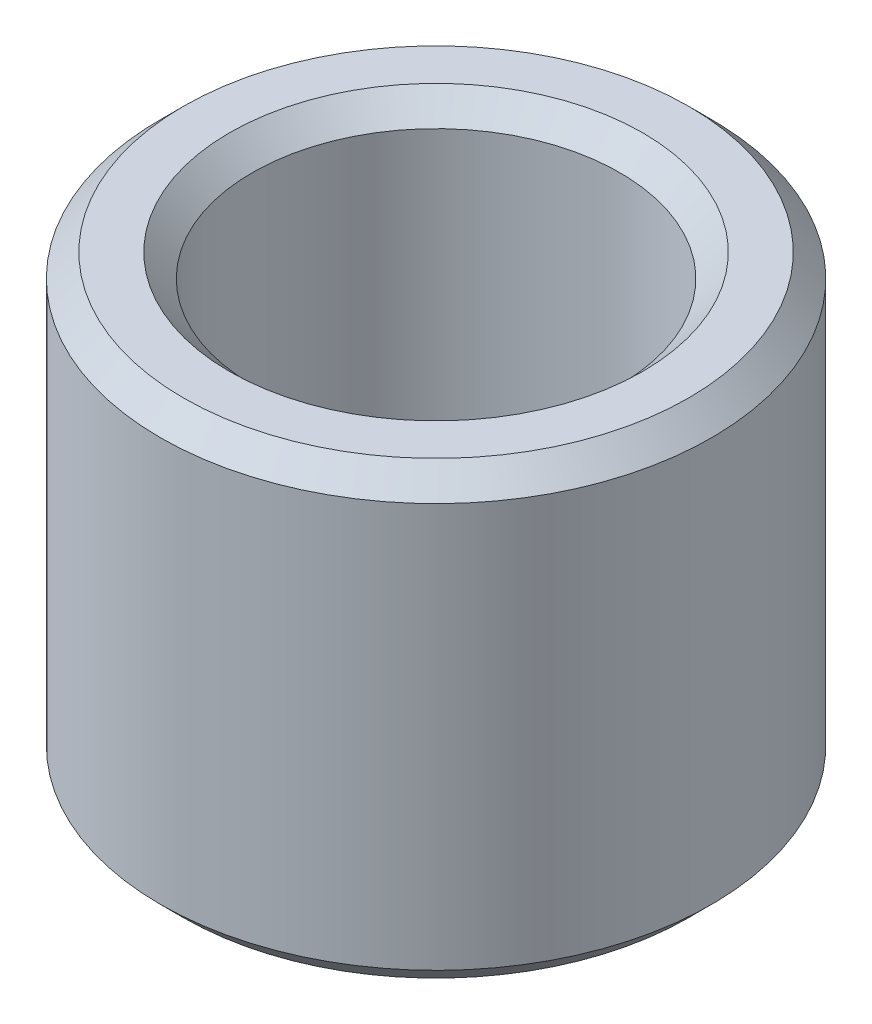
ISO-10303-21;
HEADER;
FILE_DESCRIPTION(('STEP AP214'),'2;1');
FILE_NAME('part.step','',(''),(''),'','','');
FILE_SCHEMA(('AUTOMOTIVE_DESIGN { 1 0 10303 214 1 1 1 1 }'));
ENDSEC;
DATA;
#1=APPLICATION_CONTEXT('core data for automotive mechanical design processes');
#2=APPLICATION_PROTOCOL_DEFINITION('international standard','automotive_design',2000,#1);
#3=PRODUCT_CONTEXT('',#1,'mechanical');
#4=PRODUCT('Part','Part','',(#3));
#5=PRODUCT_RELATED_PRODUCT_CATEGORY('part','',(#4));
#6=PRODUCT_DEFINITION_FORMATION('','',#4);
#7=PRODUCT_DEFINITION_CONTEXT('part definition',#1,'design');
#8=PRODUCT_DEFINITION('design','',#6,#7);
#9=PRODUCT_DEFINITION_SHAPE('','',#8);
#10=(LENGTH_UNIT() NAMED_UNIT(*) SI_UNIT(.MILLI.,.METRE.));
#11=(NAMED_UNIT(*) PLANE_ANGLE_UNIT() SI_UNIT($,.RADIAN.));
#12=(NAMED_UNIT(*) SI_UNIT($,.STERADIAN.) SOLID_ANGLE_UNIT());
#13=UNCERTAINTY_MEASURE_WITH_UNIT(LENGTH_MEASURE(1.E-05),#10,'distance_accuracy_value','');
#14=(GEOMETRIC_REPRESENTATION_CONTEXT(3) GLOBAL_UNCERTAINTY_ASSIGNED_CONTEXT((#13)) GLOBAL_UNIT_ASSIGNED_CONTEXT((#10,
#11,#12)) REPRESENTATION_CONTEXT('',''));
#15=CARTESIAN_POINT('',(0.,0.,0.));
#16=DIRECTION('',(0.,0.,1.));
#17=DIRECTION('',(1.,0.,0.));
#18=AXIS2_PLACEMENT_3D('',#15,#16,#17);
#19=CARTESIAN_POINT('',(0.,2.45,0.));
#20=DIRECTION('',(0.,1.,0.));
#21=DIRECTION('',(0.,0.,1.00000000000001));
#22=AXIS2_PLACEMENT_3D('',#19,#20,#21);
#23=PLANE('',#22);
#24=CARTESIAN_POINT('',(0.,2.45,0.));
#25=DIRECTION('',(0.,1.,0.));
#26=DIRECTION('',(0.,0.,1.00000000000001));
#27=AXIS2_PLACEMENT_3D('',#24,#25,#26);
#28=CIRCLE('',#27,2.75);
#29=CARTESIAN_POINT('',(0.,2.45,2.75000000000002));
#30=VERTEX_POINT('',#29);
#31=EDGE_CURVE('E57',#30,#30,#28,.T.);
#32=ORIENTED_EDGE('',*,*,#31,.T.);
#33=EDGE_LOOP('',(#32));
#34=FACE_BOUND('',#33,.T.);
#35=CARTESIAN_POINT('',(0.,2.45,0.));
#36=DIRECTION('',(0.,1.,0.));
#37=DIRECTION('',(0.,0.,1.00000000000001));
#38=AXIS2_PLACEMENT_3D('',#35,#36,#37);
#39=CIRCLE('',#38,2.25);
#40=CARTESIAN_POINT('',(0.,2.45,2.25000000000002));
#41=VERTEX_POINT('',#40);
#42=EDGE_CURVE('E63',#41,#41,#39,.F.);
#43=ORIENTED_EDGE('',*,*,#42,.T.);
#44=EDGE_LOOP('',(#43));
#45=FACE_BOUND('',#44,.T.);
#46=ADVANCED_FACE('F42',(#34,#45),#23,.T.);
#47=CARTESIAN_POINT('',(0.,-2.45,0.));
#48=DIRECTION('',(0.,1.,0.));
#49=DIRECTION('',(0.,0.,1.00000000000001));
#50=AXIS2_PLACEMENT_3D('',#47,#48,#49);
#51=PLANE('',#50);
#52=CARTESIAN_POINT('',(0.,-2.45,0.));
#53=DIRECTION('',(0.,1.,0.));
#54=DIRECTION('',(0.,0.,1.00000000000001));
#55=AXIS2_PLACEMENT_3D('',#52,#53,#54);
#56=CIRCLE('',#55,2.75);
#57=CARTESIAN_POINT('',(0.,-2.45,2.75000000000002));
#58=VERTEX_POINT('',#57);
#59=EDGE_CURVE('E68',#58,#58,#56,.F.);
#60=ORIENTED_EDGE('',*,*,#59,.T.);
#61=EDGE_LOOP('',(#60));
#62=FACE_BOUND('',#61,.T.);
#63=CARTESIAN_POINT('',(0.,-2.45,0.));
#64=DIRECTION('',(0.,1.,0.));
#65=DIRECTION('',(0.,0.,1.00000000000001));
#66=AXIS2_PLACEMENT_3D('',#63,#64,#65);
#67=CIRCLE('',#66,2.25);
#68=CARTESIAN_POINT('',(0.,-2.45,2.25000000000002));
#69=VERTEX_POINT('',#68);
#70=EDGE_CURVE('E71',#69,#69,#67,.T.);
#71=ORIENTED_EDGE('',*,*,#70,.T.);
#72=EDGE_LOOP('',(#71));
#73=FACE_BOUND('',#72,.T.);
#74=ADVANCED_FACE('F95',(#62,#73),#51,.F.);
#75=CARTESIAN_POINT('',(0.,2.45,0.));
#76=DIRECTION('',(0.,-1.,0.));
#77=DIRECTION('',(0.,0.,-1.00000000000001));
#78=AXIS2_PLACEMENT_3D('',#75,#76,#77);
#79=CYLINDRICAL_SURFACE('',#78,3.);
#80=CARTESIAN_POINT('',(0.,-2.2,0.));
#81=DIRECTION('',(0.,1.,0.));
#82=DIRECTION('',(0.,0.,1.00000000000001));
#83=AXIS2_PLACEMENT_3D('',#80,#81,#82);
#84=CIRCLE('',#83,3.);
#85=CARTESIAN_POINT('',(0.,-2.2,3.00000000000003));
#86=VERTEX_POINT('',#85);
#87=EDGE_CURVE('E74',#86,#86,#84,.T.);
#88=ORIENTED_EDGE('',*,*,#87,.T.);
#89=EDGE_LOOP('',(#88));
#90=FACE_BOUND('',#89,.T.);
#91=CARTESIAN_POINT('',(0.,2.2,0.));
#92=DIRECTION('',(0.,1.,0.));
#93=DIRECTION('',(0.,0.,1.00000000000001));
#94=AXIS2_PLACEMENT_3D('',#91,#92,#93);
#95=CIRCLE('',#94,3.);
#96=CARTESIAN_POINT('',(0.,2.2,3.00000000000003));
#97=VERTEX_POINT('',#96);
#98=EDGE_CURVE('E78',#97,#97,#95,.F.);
#99=ORIENTED_EDGE('',*,*,#98,.T.);
#100=EDGE_LOOP('',(#99));
#101=FACE_BOUND('',#100,.T.);
#102=ADVANCED_FACE('F83',(#90,#101),#79,.T.);
#103=CARTESIAN_POINT('',(0.,2.45,0.));
#104=DIRECTION('',(0.,-1.,0.));
#105=DIRECTION('',(0.,0.,-1.00000000000001));
#106=AXIS2_PLACEMENT_3D('',#103,#104,#105);
#107=CYLINDRICAL_SURFACE('',#106,2.);
#108=CARTESIAN_POINT('',(0.,-2.2,0.));
#109=DIRECTION('',(0.,1.,0.));
#110=DIRECTION('',(0.,0.,1.00000000000001));
#111=AXIS2_PLACEMENT_3D('',#108,#109,#110);
#112=CIRCLE('',#111,2.);
#113=CARTESIAN_POINT('',(0.,-2.2,2.00000000000002));
#114=VERTEX_POINT('',#113);
#115=EDGE_CURVE('E10',#114,#114,#112,.F.);
#116=ORIENTED_EDGE('',*,*,#115,.T.);
#117=EDGE_LOOP('',(#116));
#118=FACE_BOUND('',#117,.T.);
#119=CARTESIAN_POINT('',(0.,2.2,0.));
#120=DIRECTION('',(0.,1.,0.));
#121=DIRECTION('',(0.,0.,1.00000000000001));
#122=AXIS2_PLACEMENT_3D('',#119,#120,#121);
#123=CIRCLE('',#122,2.);
#124=CARTESIAN_POINT('',(0.,2.2,2.00000000000002));
#125=VERTEX_POINT('',#124);
#126=EDGE_CURVE('E50',#125,#125,#123,.T.);
#127=ORIENTED_EDGE('',*,*,#126,.T.);
#128=EDGE_LOOP('',(#127));
#129=FACE_BOUND('',#128,.T.);
#130=ADVANCED_FACE('F111',(#118,#129),#107,.F.);
#131=CARTESIAN_POINT('',(0.,-2.2,0.));
#132=DIRECTION('',(0.,1.,0.));
#133=DIRECTION('',(0.,0.,1.00000000000001));
#134=AXIS2_PLACEMENT_3D('',#131,#132,#133);
#135=CONICAL_SURFACE('',#134,3.,0.78539816339745);
#136=ORIENTED_EDGE('',*,*,#59,.F.);
#137=EDGE_LOOP('',(#136));
#138=FACE_BOUND('',#137,.T.);
#139=ORIENTED_EDGE('',*,*,#87,.F.);
#140=EDGE_LOOP('',(#139));
#141=FACE_BOUND('',#140,.T.);
#142=ADVANCED_FACE('F89',(#138,#141),#135,.T.);
#143=CARTESIAN_POINT('',(0.,2.45,0.));
#144=DIRECTION('',(0.,-1.,0.));
#145=DIRECTION('',(0.,0.,-1.00000000000001));
#146=AXIS2_PLACEMENT_3D('',#143,#144,#145);
#147=CONICAL_SURFACE('',#146,2.75,0.785398163397444);
#148=ORIENTED_EDGE('',*,*,#98,.F.);
#149=EDGE_LOOP('',(#148));
#150=FACE_BOUND('',#149,.T.);
#151=ORIENTED_EDGE('',*,*,#31,.F.);
#152=EDGE_LOOP('',(#151));
#153=FACE_BOUND('',#152,.T.);
#154=ADVANCED_FACE('F85',(#150,#153),#147,.T.);
#155=CARTESIAN_POINT('',(0.,-2.45,0.));
#156=DIRECTION('',(0.,-1.,0.));
#157=DIRECTION('',(0.,0.,-1.00000000000001));
#158=AXIS2_PLACEMENT_3D('',#155,#156,#157);
#159=CONICAL_SURFACE('',#158,2.25,0.785398163397445);
#160=ORIENTED_EDGE('',*,*,#115,.F.);
#161=EDGE_LOOP('',(#160));
#162=FACE_BOUND('',#161,.T.);
#163=ORIENTED_EDGE('',*,*,#70,.F.);
#164=EDGE_LOOP('',(#163));
#165=FACE_BOUND('',#164,.T.);
#166=ADVANCED_FACE('F88',(#162,#165),#159,.F.);
#167=CARTESIAN_POINT('',(0.,2.2,0.));
#168=DIRECTION('',(0.,1.,0.));
#169=DIRECTION('',(0.,0.,1.00000000000001));
#170=AXIS2_PLACEMENT_3D('',#167,#168,#169);
#171=CONICAL_SURFACE('',#170,2.,0.785398163397452);
#172=ORIENTED_EDGE('',*,*,#42,.F.);
#173=EDGE_LOOP('',(#172));
#174=FACE_BOUND('',#173,.T.);
#175=ORIENTED_EDGE('',*,*,#126,.F.);
#176=EDGE_LOOP('',(#175));
#177=FACE_BOUND('',#176,.T.);
#178=ADVANCED_FACE('F44',(#174,#177),#171,.F.);
#179=CLOSED_SHELL('',(#46,#74,#102,#130,#142,#154,#166,#178));
#180=MANIFOLD_SOLID_BREP('B2',#179);
#181=ADVANCED_BREP_SHAPE_REPRESENTATION('',(#18,#180),#14);
#182=SHAPE_DEFINITION_REPRESENTATION(#9,#181);
ENDSEC;
END-ISO-10303-21;
